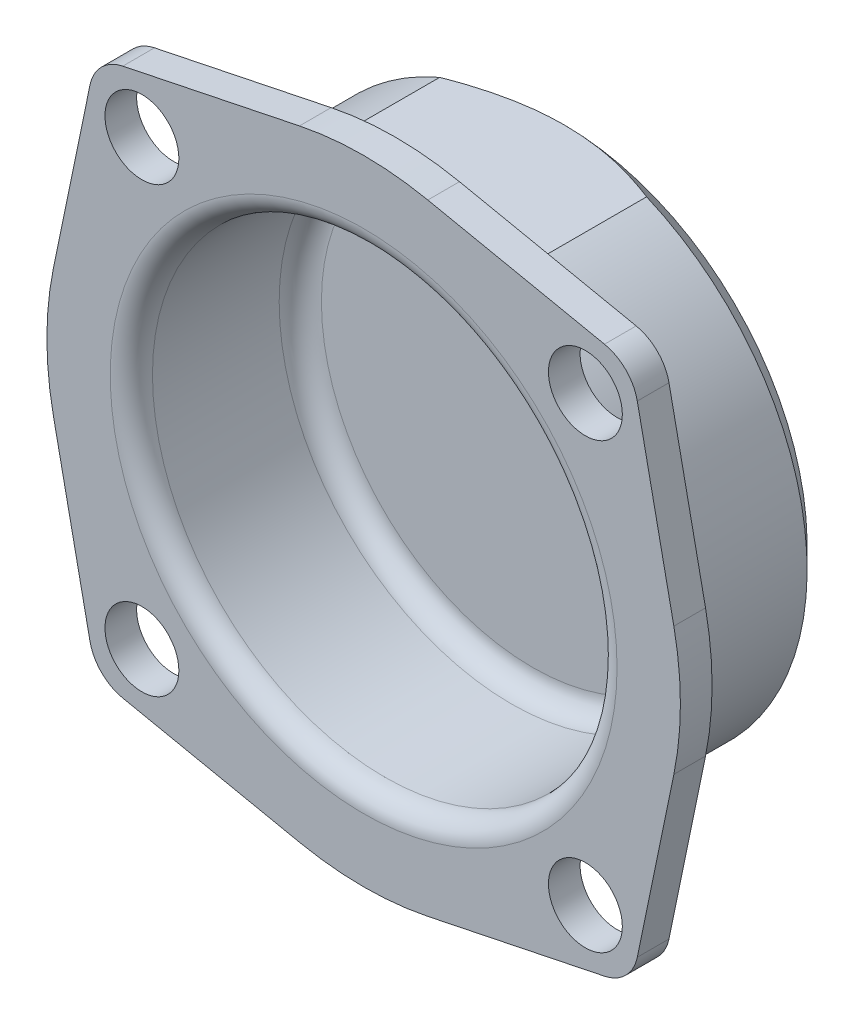
ISO-10303-21;
HEADER;
FILE_DESCRIPTION(('STEP AP214'),'2;1');
FILE_NAME('part.step','',(''),(''),'','','');
FILE_SCHEMA(('AUTOMOTIVE_DESIGN { 1 0 10303 214 1 1 1 1 }'));
ENDSEC;
DATA;
#1=APPLICATION_CONTEXT('core data for automotive mechanical design processes');
#2=APPLICATION_PROTOCOL_DEFINITION('international standard','automotive_design',2000,#1);
#3=PRODUCT_CONTEXT('',#1,'mechanical');
#4=PRODUCT('Part','Part','',(#3));
#5=PRODUCT_RELATED_PRODUCT_CATEGORY('part','',(#4));
#6=PRODUCT_DEFINITION_FORMATION('','',#4);
#7=PRODUCT_DEFINITION_CONTEXT('part definition',#1,'design');
#8=PRODUCT_DEFINITION('design','',#6,#7);
#9=PRODUCT_DEFINITION_SHAPE('','',#8);
#10=(LENGTH_UNIT() NAMED_UNIT(*) SI_UNIT(.MILLI.,.METRE.));
#11=(NAMED_UNIT(*) PLANE_ANGLE_UNIT() SI_UNIT($,.RADIAN.));
#12=(NAMED_UNIT(*) SI_UNIT($,.STERADIAN.) SOLID_ANGLE_UNIT());
#13=UNCERTAINTY_MEASURE_WITH_UNIT(LENGTH_MEASURE(1.E-05),#10,'distance_accuracy_value','');
#14=(GEOMETRIC_REPRESENTATION_CONTEXT(3) GLOBAL_UNCERTAINTY_ASSIGNED_CONTEXT((#13)) GLOBAL_UNIT_ASSIGNED_CONTEXT((#10,
#11,#12)) REPRESENTATION_CONTEXT('',''));
#15=CARTESIAN_POINT('',(0.,0.,0.));
#16=DIRECTION('',(0.,0.,1.));
#17=DIRECTION('',(1.,0.,0.));
#18=AXIS2_PLACEMENT_3D('',#15,#16,#17);
#19=CARTESIAN_POINT('',(0.,0.,-8.));
#20=DIRECTION('',(0.,0.,1.));
#21=DIRECTION('',(1.,0.,0.));
#22=AXIS2_PLACEMENT_3D('',#19,#20,#21);
#23=CYLINDRICAL_SURFACE('',#22,12.5);
#24=DIRECTION('',(0.,0.,1.));
#25=VECTOR('',#24,1.);
#26=CARTESIAN_POINT('',(-4.89897948556636,11.5,-8.));
#27=LINE('',#26,#25);
#28=CARTESIAN_POINT('',(-4.89897948556637,11.5,-7.));
#29=VERTEX_POINT('',#28);
#30=CARTESIAN_POINT('',(-4.89897948556636,11.5,0.));
#31=VERTEX_POINT('',#30);
#32=EDGE_CURVE('E462',#29,#31,#27,.T.);
#33=ORIENTED_EDGE('',*,*,#32,.F.);
#34=CARTESIAN_POINT('',(0.,0.,-7.));
#35=DIRECTION('',(0.,0.,-1.));
#36=DIRECTION('',(-1.,0.,0.));
#37=AXIS2_PLACEMENT_3D('',#34,#35,#36);
#38=CIRCLE('',#37,12.5);
#39=CARTESIAN_POINT('',(4.89897948556636,11.5,-7.));
#40=VERTEX_POINT('',#39);
#41=EDGE_CURVE('E175',#29,#40,#38,.F.);
#42=ORIENTED_EDGE('',*,*,#41,.T.);
#43=DIRECTION('',(0.,0.,1.));
#44=VECTOR('',#43,1.);
#45=CARTESIAN_POINT('',(4.89897948556636,11.5,-8.));
#46=LINE('',#45,#44);
#47=CARTESIAN_POINT('',(4.89897948556636,11.5,0.));
#48=VERTEX_POINT('',#47);
#49=EDGE_CURVE('E54',#48,#40,#46,.F.);
#50=ORIENTED_EDGE('',*,*,#49,.F.);
#51=CARTESIAN_POINT('',(0.,0.,0.));
#52=DIRECTION('',(0.,0.,1.));
#53=DIRECTION('',(1.,0.,0.));
#54=AXIS2_PLACEMENT_3D('',#51,#52,#53);
#55=CIRCLE('',#54,12.5);
#56=EDGE_CURVE('E178',#48,#31,#55,.F.);
#57=ORIENTED_EDGE('',*,*,#56,.T.);
#58=EDGE_LOOP('',(#33,#42,#50,#57));
#59=FACE_BOUND('',#58,.T.);
#60=ADVANCED_FACE('F34',(#59),#23,.T.);
#61=CARTESIAN_POINT('',(0.,0.,-8.));
#62=DIRECTION('',(0.,0.,1.));
#63=DIRECTION('',(1.,0.,0.));
#64=AXIS2_PLACEMENT_3D('',#61,#62,#63);
#65=CONICAL_SURFACE('',#64,11.5,0.785398163397447);
#66=ORIENTED_EDGE('',*,*,#41,.F.);
#67=CARTESIAN_POINT('',(-16.7893806539627,11.5,0.850265421946186));
#68=CARTESIAN_POINT('',(-16.5781152123925,11.5,0.675970375607753));
#69=CARTESIAN_POINT('',(-16.3663375360615,11.5,0.502296373561241));
#70=CARTESIAN_POINT('',(-15.941654846608,11.5,0.156326545011898));
#71=CARTESIAN_POINT('',(-15.7287498180874,11.5,-0.0159692625855204));
#72=CARTESIAN_POINT('',(-15.0880959462895,11.5,-0.530660186421689));
#73=CARTESIAN_POINT('',(-14.6585092962424,11.5,-0.870775283439131));
#74=CARTESIAN_POINT('',(-13.7887008329747,11.5,-1.54721063856355));
#75=CARTESIAN_POINT('',(-13.3484139572344,11.5,-1.88344745885357));
#76=CARTESIAN_POINT('',(-12.4606521653116,11.5,-2.54621997002668));
#77=CARTESIAN_POINT('',(-12.0131779611118,11.5,-2.8727566127966));
#78=CARTESIAN_POINT('',(-11.0655960044422,11.5,-3.54459786241297));
#79=CARTESIAN_POINT('',(-10.5645928452057,11.5,-3.88865088814603));
#80=CARTESIAN_POINT('',(-9.80316699203502,11.5,-4.38987855089019));
#81=CARTESIAN_POINT('',(-9.54764936532944,11.5,-4.55451261414054));
#82=CARTESIAN_POINT('',(-9.03295907910541,11.5,-4.87795434418192));
#83=CARTESIAN_POINT('',(-8.77378660212332,11.5,-5.03676230053297));
#84=CARTESIAN_POINT('',(-8.2525927972949,11.5,-5.34685088337027));
#85=CARTESIAN_POINT('',(-7.99059025353737,11.5,-5.49816300093233));
#86=CARTESIAN_POINT('',(-7.46213638530956,11.5,-5.79287165256753));
#87=CARTESIAN_POINT('',(-7.19568482449373,11.5,-5.93626776436429));
#88=CARTESIAN_POINT('',(-6.65814470815917,11.5,-6.21361877800879));
#89=CARTESIAN_POINT('',(-6.3870597373284,11.5,-6.34758060140613));
#90=CARTESIAN_POINT('',(-5.8397462138639,11.5,-6.60448697073004));
#91=CARTESIAN_POINT('',(-5.56351861036631,11.5,-6.7274335257846));
#92=CARTESIAN_POINT('',(-5.08838294776905,11.5,-6.92582450474964));
#93=CARTESIAN_POINT('',(-4.89084353245352,11.5,-7.00454183515921));
#94=CARTESIAN_POINT('',(-4.49307368490328,11.5,-7.15480796518391));
#95=CARTESIAN_POINT('',(-4.29284326969638,11.5,-7.22635681013479));
#96=CARTESIAN_POINT('',(-3.68799462005856,11.5,-7.42907712272961));
#97=CARTESIAN_POINT('',(-3.27920983645376,11.5,-7.54832626155526));
#98=CARTESIAN_POINT('',(-2.66380646654365,11.5,-7.6971464780819));
#99=CARTESIAN_POINT('',(-2.46065900763788,11.5,-7.74139924904552));
#100=CARTESIAN_POINT('',(-2.05246632515672,11.5,-7.81999370495297));
#101=CARTESIAN_POINT('',(-1.84742143183298,11.5,-7.85433708236045));
#102=CARTESIAN_POINT('',(-1.43586143588119,11.5,-7.91249812274399));
#103=CARTESIAN_POINT('',(-1.22934648189982,11.5,-7.93631683499167));
#104=CARTESIAN_POINT('',(-0.815340554579247,11.5,-7.972976266415));
#105=CARTESIAN_POINT('',(-0.60784959986402,11.5,-7.98581719422021));
#106=CARTESIAN_POINT('',(-0.203862685658172,11.5,-7.9998666522852));
#107=CARTESIAN_POINT('',(-0.00738741914860604,11.5,-8.00167417627281));
#108=CARTESIAN_POINT('',(0.385419506898061,11.5,-7.99521933224475));
#109=CARTESIAN_POINT('',(0.581751147457329,11.5,-7.98695581339273));
#110=CARTESIAN_POINT('',(0.973727497499538,11.5,-7.96050606581626));
#111=CARTESIAN_POINT('',(1.1693722645929,11.5,-7.94232069029956));
#112=CARTESIAN_POINT('',(1.55954085045931,11.5,-7.89635450354384));
#113=CARTESIAN_POINT('',(1.75406450676635,11.5,-7.86857233544811));
#114=CARTESIAN_POINT('',(2.34278481038758,11.5,-7.7702396159328));
#115=CARTESIAN_POINT('',(2.73463308785112,11.5,-7.68523071640806));
#116=CARTESIAN_POINT('',(3.50946382045011,11.5,-7.48225481038822));
#117=CARTESIAN_POINT('',(3.8924463631884,11.5,-7.36428812970148));
#118=CARTESIAN_POINT('',(4.65553265872848,11.5,-7.09863984114778));
#119=CARTESIAN_POINT('',(5.03546293520018,11.5,-6.95046531148941));
#120=CARTESIAN_POINT('',(5.78561365161127,11.5,-6.63112210212623));
#121=CARTESIAN_POINT('',(6.1558297747009,11.5,-6.45994339977846));
#122=CARTESIAN_POINT('',(6.88825377985408,11.5,-6.09864750750538));
#123=CARTESIAN_POINT('',(7.25043331947737,11.5,-5.90847332424411));
#124=CARTESIAN_POINT('',(7.96651940017898,11.5,-5.51335323980783));
#125=CARTESIAN_POINT('',(8.32042716545895,11.5,-5.30840954305199));
#126=CARTESIAN_POINT('',(9.00371944014477,11.5,-4.89704477088385));
#127=CARTESIAN_POINT('',(9.33345132945047,11.5,-4.69119765945711));
#128=CARTESIAN_POINT('',(9.98724918210649,11.5,-4.27066877256768));
#129=CARTESIAN_POINT('',(10.3113147240286,11.5,-4.05598634393704));
#130=CARTESIAN_POINT('',(10.9519411526873,11.5,-3.6210819828637));
#131=CARTESIAN_POINT('',(11.2685411759533,11.5,-3.4009174919943));
#132=CARTESIAN_POINT('',(11.8973875507789,11.5,-2.9546304003391));
#133=CARTESIAN_POINT('',(12.2096350775222,11.5,-2.72850945739908));
#134=CARTESIAN_POINT('',(12.5200543334183,11.5,-2.49994822032164));
#135=B_SPLINE_CURVE_WITH_KNOTS('',3,(#67,#68,#69,#70,#71,#72,#73,#74,#75,#76,#77,#78,#79,#80,
#81,#82,#83,#84,#85,#86,#87,#88,#89,#90,#91,#92,#93,#94,#95,#96,#97,#98,#99,#100,#101,#102,#103,
#104,#105,#106,#107,#108,#109,#110,#111,#112,#113,#114,#115,#116,#117,#118,#119,#120,#121,#122,
#123,#124,#125,#126,#127,#128,#129,#130,#131,#132,#133,#134),.UNSPECIFIED.,.F.,.F.,(4,2,2,2,2,2,
2,2,2,2,2,2,2,2,2,2,2,2,2,2,2,2,2,2,2,2,2,2,2,2,2,2,2,4),(0.,0.821646739742719,1.64330473118004,
3.28701381270533,4.94888238357663,6.61058733148289,8.43346611694427,9.34529408146708,
10.2570766661826,11.1646310892773,12.0722338788335,12.9791637070034,13.8859277776618,
14.5237304591109,15.1615291066404,16.4370966523403,17.0606376750111,17.6840721375749,
18.3074444319117,18.9308048789779,19.5199990671665,20.1092605899582,20.6984714485147,
21.2877656476402,22.4888066466736,23.6898357730833,24.9123078459458,26.1353142725621,
27.3621071656067,28.5887173317757,29.7546852611505,30.9207395423446,32.0775453151114,
33.2340324495483),.UNSPECIFIED.);
#136=CARTESIAN_POINT('',(0.,11.5,-8.));
#137=VERTEX_POINT('',#136);
#138=EDGE_CURVE('E11',#29,#137,#135,.T.);
#139=ORIENTED_EDGE('',*,*,#138,.T.);
#140=CARTESIAN_POINT('',(0.,0.,-8.));
#141=DIRECTION('',(0.,0.,-1.));
#142=DIRECTION('',(-1.,0.,0.));
#143=AXIS2_PLACEMENT_3D('',#140,#141,#142);
#144=CIRCLE('',#143,11.5);
#145=EDGE_CURVE('E174',#137,#137,#144,.T.);
#146=ORIENTED_EDGE('',*,*,#145,.F.);
#147=EDGE_CURVE('E38',#137,#40,#135,.T.);
#148=ORIENTED_EDGE('',*,*,#147,.T.);
#149=EDGE_LOOP('',(#66,#139,#146,#148));
#150=FACE_BOUND('',#149,.T.);
#151=ADVANCED_FACE('F173',(#150),#65,.T.);
#152=CARTESIAN_POINT('',(11.,11.,0.));
#153=DIRECTION('',(0.,0.,1.));
#154=DIRECTION('',(1.,0.,0.));
#155=AXIS2_PLACEMENT_3D('',#152,#153,#154);
#156=PLANE('',#155);
#157=ORIENTED_EDGE('',*,*,#56,.F.);
#158=DIRECTION('',(-1.,0.,0.));
#159=VECTOR('',#158,1.);
#160=CARTESIAN_POINT('',(7.6799024524554,11.5,0.));
#161=LINE('',#160,#159);
#162=EDGE_CURVE('E465',#48,#31,#161,.T.);
#163=ORIENTED_EDGE('',*,*,#162,.T.);
#164=EDGE_LOOP('',(#157,#163));
#165=FACE_BOUND('',#164,.T.);
#166=CARTESIAN_POINT('',(0.,0.,0.));
#167=DIRECTION('',(0.,0.,1.));
#168=DIRECTION('',(1.,0.,0.));
#169=AXIS2_PLACEMENT_3D('',#166,#167,#168);
#170=CIRCLE('',#169,15.);
#171=CARTESIAN_POINT('',(3.03817926455623,14.6890934627165,0.));
#172=VERTEX_POINT('',#171);
#173=CARTESIAN_POINT('',(-3.03817926455623,14.6890934627165,0.));
#174=VERTEX_POINT('',#173);
#175=EDGE_CURVE('E321',#172,#174,#170,.T.);
#176=ORIENTED_EDGE('',*,*,#175,.F.);
#177=DIRECTION('',(-0.979272897514433,0.202545284303748,0.));
#178=VECTOR('',#177,1.);
#179=CARTESIAN_POINT('',(11.4050905686075,12.9585457950289,0.));
#180=LINE('',#179,#178);
#181=CARTESIAN_POINT('',(11.4050905686075,12.9585457950289,0.));
#182=VERTEX_POINT('',#181);
#183=EDGE_CURVE('E312',#182,#172,#180,.T.);
#184=ORIENTED_EDGE('',*,*,#183,.F.);
#185=CARTESIAN_POINT('',(11.,11.,0.));
#186=DIRECTION('',(0.,0.,1.));
#187=DIRECTION('',(1.,0.,0.));
#188=AXIS2_PLACEMENT_3D('',#185,#186,#187);
#189=CIRCLE('',#188,2.00000000000001);
#190=CARTESIAN_POINT('',(12.9585457950289,11.4050905686075,0.));
#191=VERTEX_POINT('',#190);
#192=EDGE_CURVE('E322',#191,#182,#189,.T.);
#193=ORIENTED_EDGE('',*,*,#192,.F.);
#194=DIRECTION('',(-0.202545284303748,0.979272897514433,0.));
#195=VECTOR('',#194,1.);
#196=CARTESIAN_POINT('',(14.6890934627165,3.03817926455623,0.));
#197=LINE('',#196,#195);
#198=CARTESIAN_POINT('',(14.6890934627165,3.03817926455623,0.));
#199=VERTEX_POINT('',#198);
#200=EDGE_CURVE('E359',#199,#191,#197,.T.);
#201=ORIENTED_EDGE('',*,*,#200,.F.);
#202=CARTESIAN_POINT('',(0.,0.,0.));
#203=DIRECTION('',(0.,0.,1.));
#204=DIRECTION('',(1.,0.,0.));
#205=AXIS2_PLACEMENT_3D('',#202,#203,#204);
#206=CIRCLE('',#205,15.);
#207=CARTESIAN_POINT('',(14.6890934627165,-3.03817926455622,0.));
#208=VERTEX_POINT('',#207);
#209=EDGE_CURVE('E357',#208,#199,#206,.T.);
#210=ORIENTED_EDGE('',*,*,#209,.F.);
#211=DIRECTION('',(0.202545284303748,0.979272897514433,0.));
#212=VECTOR('',#211,1.);
#213=CARTESIAN_POINT('',(12.9585457950289,-11.4050905686075,0.));
#214=LINE('',#213,#212);
#215=CARTESIAN_POINT('',(12.9585457950289,-11.4050905686075,0.));
#216=VERTEX_POINT('',#215);
#217=EDGE_CURVE('E355',#216,#208,#214,.T.);
#218=ORIENTED_EDGE('',*,*,#217,.F.);
#219=CARTESIAN_POINT('',(11.,-11.,0.));
#220=DIRECTION('',(0.,0.,1.));
#221=DIRECTION('',(1.,0.,0.));
#222=AXIS2_PLACEMENT_3D('',#219,#220,#221);
#223=CIRCLE('',#222,2.);
#224=CARTESIAN_POINT('',(11.4050905686075,-12.9585457950289,0.));
#225=VERTEX_POINT('',#224);
#226=EDGE_CURVE('E353',#225,#216,#223,.T.);
#227=ORIENTED_EDGE('',*,*,#226,.F.);
#228=DIRECTION('',(0.979272897514433,0.202545284303749,0.));
#229=VECTOR('',#228,1.);
#230=CARTESIAN_POINT('',(3.03817926455623,-14.6890934627165,0.));
#231=LINE('',#230,#229);
#232=CARTESIAN_POINT('',(3.03817926455623,-14.6890934627165,0.));
#233=VERTEX_POINT('',#232);
#234=EDGE_CURVE('E351',#233,#225,#231,.T.);
#235=ORIENTED_EDGE('',*,*,#234,.F.);
#236=CARTESIAN_POINT('',(0.,0.,0.));
#237=DIRECTION('',(0.,0.,1.));
#238=DIRECTION('',(1.,0.,0.));
#239=AXIS2_PLACEMENT_3D('',#236,#237,#238);
#240=CIRCLE('',#239,15.);
#241=CARTESIAN_POINT('',(-3.03817926455624,-14.6890934627165,0.));
#242=VERTEX_POINT('',#241);
#243=EDGE_CURVE('E349',#242,#233,#240,.T.);
#244=ORIENTED_EDGE('',*,*,#243,.F.);
#245=DIRECTION('',(0.979272897514433,-0.20254528430375,0.));
#246=VECTOR('',#245,1.);
#247=CARTESIAN_POINT('',(-11.4050905686075,-12.9585457950289,0.));
#248=LINE('',#247,#246);
#249=CARTESIAN_POINT('',(-11.4050905686075,-12.9585457950289,0.));
#250=VERTEX_POINT('',#249);
#251=EDGE_CURVE('E347',#250,#242,#248,.T.);
#252=ORIENTED_EDGE('',*,*,#251,.F.);
#253=CARTESIAN_POINT('',(-11.,-11.,0.));
#254=DIRECTION('',(0.,0.,1.));
#255=DIRECTION('',(1.,0.,0.));
#256=AXIS2_PLACEMENT_3D('',#253,#254,#255);
#257=CIRCLE('',#256,2.);
#258=CARTESIAN_POINT('',(-12.9585457950289,-11.4050905686075,0.));
#259=VERTEX_POINT('',#258);
#260=EDGE_CURVE('E345',#259,#250,#257,.T.);
#261=ORIENTED_EDGE('',*,*,#260,.F.);
#262=DIRECTION('',(0.202545284303749,-0.979272897514433,0.));
#263=VECTOR('',#262,1.);
#264=CARTESIAN_POINT('',(-14.6890934627165,-3.03817926455623,0.));
#265=LINE('',#264,#263);
#266=CARTESIAN_POINT('',(-14.6890934627165,-3.03817926455623,0.));
#267=VERTEX_POINT('',#266);
#268=EDGE_CURVE('E343',#267,#259,#265,.T.);
#269=ORIENTED_EDGE('',*,*,#268,.F.);
#270=CARTESIAN_POINT('',(0.,0.,0.));
#271=DIRECTION('',(0.,0.,1.));
#272=DIRECTION('',(1.,0.,0.));
#273=AXIS2_PLACEMENT_3D('',#270,#271,#272);
#274=CIRCLE('',#273,15.);
#275=CARTESIAN_POINT('',(-14.6890934627165,3.03817926455624,0.));
#276=VERTEX_POINT('',#275);
#277=EDGE_CURVE('E341',#276,#267,#274,.T.);
#278=ORIENTED_EDGE('',*,*,#277,.F.);
#279=DIRECTION('',(-0.202545284303749,-0.979272897514433,0.));
#280=VECTOR('',#279,1.);
#281=CARTESIAN_POINT('',(-12.9585457950289,11.4050905686075,0.));
#282=LINE('',#281,#280);
#283=CARTESIAN_POINT('',(-12.9585457950289,11.4050905686075,0.));
#284=VERTEX_POINT('',#283);
#285=EDGE_CURVE('E339',#284,#276,#282,.T.);
#286=ORIENTED_EDGE('',*,*,#285,.F.);
#287=CARTESIAN_POINT('',(-11.,11.,0.));
#288=DIRECTION('',(0.,0.,1.));
#289=DIRECTION('',(1.,0.,0.));
#290=AXIS2_PLACEMENT_3D('',#287,#288,#289);
#291=CIRCLE('',#290,2.);
#292=CARTESIAN_POINT('',(-11.4050905686075,12.9585457950289,0.));
#293=VERTEX_POINT('',#292);
#294=EDGE_CURVE('E334',#293,#284,#291,.T.);
#295=ORIENTED_EDGE('',*,*,#294,.F.);
#296=DIRECTION('',(-0.979272897514433,-0.202545284303749,0.));
#297=VECTOR('',#296,1.);
#298=CARTESIAN_POINT('',(-11.4050905686075,12.9585457950289,0.));
#299=LINE('',#298,#297);
#300=EDGE_CURVE('E332',#174,#293,#299,.T.);
#301=ORIENTED_EDGE('',*,*,#300,.F.);
#302=EDGE_LOOP('',(#176,#184,#193,#201,#210,#218,#227,#235,#244,#252,#261,#269,#278,#286,#295,#301));
#303=FACE_BOUND('',#302,.T.);
#304=CARTESIAN_POINT('',(-10.4999999999998,-10.5,0.));
#305=DIRECTION('',(0.,0.,1.));
#306=DIRECTION('',(1.,0.,0.));
#307=AXIS2_PLACEMENT_3D('',#304,#305,#306);
#308=CIRCLE('',#307,1.75);
#309=CARTESIAN_POINT('',(-8.74999999999978,-10.5,0.));
#310=VERTEX_POINT('',#309);
#311=EDGE_CURVE('E453',#310,#310,#308,.T.);
#312=ORIENTED_EDGE('',*,*,#311,.T.);
#313=EDGE_LOOP('',(#312));
#314=FACE_BOUND('',#313,.T.);
#315=CARTESIAN_POINT('',(-10.5,10.5,0.));
#316=DIRECTION('',(0.,0.,1.));
#317=DIRECTION('',(1.,0.,0.));
#318=AXIS2_PLACEMENT_3D('',#315,#316,#317);
#319=CIRCLE('',#318,1.75);
#320=CARTESIAN_POINT('',(-8.75,10.5,0.));
#321=VERTEX_POINT('',#320);
#322=EDGE_CURVE('E439',#321,#321,#319,.T.);
#323=ORIENTED_EDGE('',*,*,#322,.T.);
#324=EDGE_LOOP('',(#323));
#325=FACE_BOUND('',#324,.T.);
#326=CARTESIAN_POINT('',(10.5,10.5000000000003,0.));
#327=DIRECTION('',(0.,0.,1.));
#328=DIRECTION('',(1.,0.,0.));
#329=AXIS2_PLACEMENT_3D('',#326,#327,#328);
#330=CIRCLE('',#329,1.75);
#331=CARTESIAN_POINT('',(12.25,10.5000000000003,0.));
#332=VERTEX_POINT('',#331);
#333=EDGE_CURVE('E447',#332,#332,#330,.T.);
#334=ORIENTED_EDGE('',*,*,#333,.T.);
#335=EDGE_LOOP('',(#334));
#336=FACE_BOUND('',#335,.T.);
#337=CARTESIAN_POINT('',(10.5000000000002,-10.4999999999997,0.));
#338=DIRECTION('',(0.,0.,1.));
#339=DIRECTION('',(1.,0.,0.));
#340=AXIS2_PLACEMENT_3D('',#337,#338,#339);
#341=CIRCLE('',#340,1.75);
#342=CARTESIAN_POINT('',(12.2500000000002,-10.4999999999997,0.));
#343=VERTEX_POINT('',#342);
#344=EDGE_CURVE('E459',#343,#343,#341,.T.);
#345=ORIENTED_EDGE('',*,*,#344,.T.);
#346=EDGE_LOOP('',(#345));
#347=FACE_BOUND('',#346,.T.);
#348=ADVANCED_FACE('F226',(#165,#303,#314,#325,#336,#347),#156,.F.);
#349=CARTESIAN_POINT('',(11.,11.,1.5));
#350=DIRECTION('',(0.,0.,1.));
#351=DIRECTION('',(1.,0.,0.));
#352=AXIS2_PLACEMENT_3D('',#349,#350,#351);
#353=PLANE('',#352);
#354=CARTESIAN_POINT('',(0.,0.,1.5));
#355=DIRECTION('',(0.,0.,1.));
#356=DIRECTION('',(1.,0.,0.));
#357=AXIS2_PLACEMENT_3D('',#354,#355,#356);
#358=CIRCLE('',#357,12.);
#359=CARTESIAN_POINT('',(12.,0.,1.5));
#360=VERTEX_POINT('',#359);
#361=EDGE_CURVE('E171',#360,#360,#358,.F.);
#362=ORIENTED_EDGE('',*,*,#361,.T.);
#363=EDGE_LOOP('',(#362));
#364=FACE_BOUND('',#363,.T.);
#365=CARTESIAN_POINT('',(-10.4999999999998,-10.5,1.5));
#366=DIRECTION('',(0.,0.,1.));
#367=DIRECTION('',(1.,0.,0.));
#368=AXIS2_PLACEMENT_3D('',#365,#366,#367);
#369=CIRCLE('',#368,1.75);
#370=CARTESIAN_POINT('',(-8.74999999999978,-10.5,1.5));
#371=VERTEX_POINT('',#370);
#372=EDGE_CURVE('E450',#371,#371,#369,.T.);
#373=ORIENTED_EDGE('',*,*,#372,.F.);
#374=EDGE_LOOP('',(#373));
#375=FACE_BOUND('',#374,.T.);
#376=CARTESIAN_POINT('',(-10.5,10.5,1.5));
#377=DIRECTION('',(0.,0.,1.));
#378=DIRECTION('',(1.,0.,0.));
#379=AXIS2_PLACEMENT_3D('',#376,#377,#378);
#380=CIRCLE('',#379,1.75);
#381=CARTESIAN_POINT('',(-8.75,10.5,1.5));
#382=VERTEX_POINT('',#381);
#383=EDGE_CURVE('E437',#382,#382,#380,.T.);
#384=ORIENTED_EDGE('',*,*,#383,.F.);
#385=EDGE_LOOP('',(#384));
#386=FACE_BOUND('',#385,.T.);
#387=CARTESIAN_POINT('',(11.,11.,1.5));
#388=DIRECTION('',(0.,0.,1.));
#389=DIRECTION('',(1.,0.,0.));
#390=AXIS2_PLACEMENT_3D('',#387,#388,#389);
#391=CIRCLE('',#390,2.00000000000001);
#392=CARTESIAN_POINT('',(12.9585457950289,11.4050905686075,1.5));
#393=VERTEX_POINT('',#392);
#394=CARTESIAN_POINT('',(11.4050905686075,12.9585457950289,1.5));
#395=VERTEX_POINT('',#394);
#396=EDGE_CURVE('E361',#393,#395,#391,.T.);
#397=ORIENTED_EDGE('',*,*,#396,.T.);
#398=DIRECTION('',(-0.979272897514433,0.202545284303748,0.));
#399=VECTOR('',#398,1.);
#400=CARTESIAN_POINT('',(11.4050905686075,12.9585457950289,1.5));
#401=LINE('',#400,#399);
#402=CARTESIAN_POINT('',(3.03817926455623,14.6890934627165,1.5));
#403=VERTEX_POINT('',#402);
#404=EDGE_CURVE('E363',#395,#403,#401,.T.);
#405=ORIENTED_EDGE('',*,*,#404,.T.);
#406=CARTESIAN_POINT('',(0.,0.,1.5));
#407=DIRECTION('',(0.,0.,1.));
#408=DIRECTION('',(1.,0.,0.));
#409=AXIS2_PLACEMENT_3D('',#406,#407,#408);
#410=CIRCLE('',#409,15.);
#411=CARTESIAN_POINT('',(-3.03817926455623,14.6890934627165,1.5));
#412=VERTEX_POINT('',#411);
#413=EDGE_CURVE('E326',#403,#412,#410,.T.);
#414=ORIENTED_EDGE('',*,*,#413,.T.);
#415=DIRECTION('',(-0.979272897514433,-0.202545284303749,0.));
#416=VECTOR('',#415,1.);
#417=CARTESIAN_POINT('',(-11.4050905686075,12.9585457950289,1.5));
#418=LINE('',#417,#416);
#419=CARTESIAN_POINT('',(-11.4050905686075,12.9585457950289,1.5));
#420=VERTEX_POINT('',#419);
#421=EDGE_CURVE('E366',#412,#420,#418,.T.);
#422=ORIENTED_EDGE('',*,*,#421,.T.);
#423=CARTESIAN_POINT('',(-11.,11.,1.5));
#424=DIRECTION('',(0.,0.,1.));
#425=DIRECTION('',(1.,0.,0.));
#426=AXIS2_PLACEMENT_3D('',#423,#424,#425);
#427=CIRCLE('',#426,2.);
#428=CARTESIAN_POINT('',(-12.9585457950289,11.4050905686075,1.5));
#429=VERTEX_POINT('',#428);
#430=EDGE_CURVE('E368',#420,#429,#427,.T.);
#431=ORIENTED_EDGE('',*,*,#430,.T.);
#432=DIRECTION('',(-0.202545284303749,-0.979272897514433,0.));
#433=VECTOR('',#432,1.);
#434=CARTESIAN_POINT('',(-12.9585457950289,11.4050905686075,1.5));
#435=LINE('',#434,#433);
#436=CARTESIAN_POINT('',(-14.6890934627165,3.03817926455624,1.5));
#437=VERTEX_POINT('',#436);
#438=EDGE_CURVE('E370',#429,#437,#435,.T.);
#439=ORIENTED_EDGE('',*,*,#438,.T.);
#440=CARTESIAN_POINT('',(0.,0.,1.5));
#441=DIRECTION('',(0.,0.,1.));
#442=DIRECTION('',(1.,0.,0.));
#443=AXIS2_PLACEMENT_3D('',#440,#441,#442);
#444=CIRCLE('',#443,15.);
#445=CARTESIAN_POINT('',(-14.6890934627165,-3.03817926455623,1.5));
#446=VERTEX_POINT('',#445);
#447=EDGE_CURVE('E372',#437,#446,#444,.T.);
#448=ORIENTED_EDGE('',*,*,#447,.T.);
#449=DIRECTION('',(0.202545284303749,-0.979272897514433,0.));
#450=VECTOR('',#449,1.);
#451=CARTESIAN_POINT('',(-14.6890934627165,-3.03817926455623,1.5));
#452=LINE('',#451,#450);
#453=CARTESIAN_POINT('',(-12.9585457950289,-11.4050905686075,1.5));
#454=VERTEX_POINT('',#453);
#455=EDGE_CURVE('E374',#446,#454,#452,.T.);
#456=ORIENTED_EDGE('',*,*,#455,.T.);
#457=CARTESIAN_POINT('',(-11.,-11.,1.5));
#458=DIRECTION('',(0.,0.,1.));
#459=DIRECTION('',(1.,0.,0.));
#460=AXIS2_PLACEMENT_3D('',#457,#458,#459);
#461=CIRCLE('',#460,2.);
#462=CARTESIAN_POINT('',(-11.4050905686075,-12.9585457950289,1.5));
#463=VERTEX_POINT('',#462);
#464=EDGE_CURVE('E376',#454,#463,#461,.T.);
#465=ORIENTED_EDGE('',*,*,#464,.T.);
#466=DIRECTION('',(0.979272897514433,-0.20254528430375,0.));
#467=VECTOR('',#466,1.);
#468=CARTESIAN_POINT('',(-11.4050905686075,-12.9585457950289,1.5));
#469=LINE('',#468,#467);
#470=CARTESIAN_POINT('',(-3.03817926455624,-14.6890934627165,1.5));
#471=VERTEX_POINT('',#470);
#472=EDGE_CURVE('E378',#463,#471,#469,.T.);
#473=ORIENTED_EDGE('',*,*,#472,.T.);
#474=CARTESIAN_POINT('',(0.,0.,1.5));
#475=DIRECTION('',(0.,0.,1.));
#476=DIRECTION('',(1.,0.,0.));
#477=AXIS2_PLACEMENT_3D('',#474,#475,#476);
#478=CIRCLE('',#477,15.);
#479=CARTESIAN_POINT('',(3.03817926455623,-14.6890934627165,1.5));
#480=VERTEX_POINT('',#479);
#481=EDGE_CURVE('E380',#471,#480,#478,.T.);
#482=ORIENTED_EDGE('',*,*,#481,.T.);
#483=DIRECTION('',(0.979272897514433,0.202545284303749,0.));
#484=VECTOR('',#483,1.);
#485=CARTESIAN_POINT('',(3.03817926455623,-14.6890934627165,1.5));
#486=LINE('',#485,#484);
#487=CARTESIAN_POINT('',(11.4050905686075,-12.9585457950289,1.5));
#488=VERTEX_POINT('',#487);
#489=EDGE_CURVE('E382',#480,#488,#486,.T.);
#490=ORIENTED_EDGE('',*,*,#489,.T.);
#491=CARTESIAN_POINT('',(11.,-11.,1.5));
#492=DIRECTION('',(0.,0.,1.));
#493=DIRECTION('',(1.,0.,0.));
#494=AXIS2_PLACEMENT_3D('',#491,#492,#493);
#495=CIRCLE('',#494,2.);
#496=CARTESIAN_POINT('',(12.9585457950289,-11.4050905686075,1.5));
#497=VERTEX_POINT('',#496);
#498=EDGE_CURVE('E384',#488,#497,#495,.T.);
#499=ORIENTED_EDGE('',*,*,#498,.T.);
#500=DIRECTION('',(0.202545284303748,0.979272897514433,0.));
#501=VECTOR('',#500,1.);
#502=CARTESIAN_POINT('',(12.9585457950289,-11.4050905686075,1.5));
#503=LINE('',#502,#501);
#504=CARTESIAN_POINT('',(14.6890934627165,-3.03817926455622,1.5));
#505=VERTEX_POINT('',#504);
#506=EDGE_CURVE('E386',#497,#505,#503,.T.);
#507=ORIENTED_EDGE('',*,*,#506,.T.);
#508=CARTESIAN_POINT('',(0.,0.,1.5));
#509=DIRECTION('',(0.,0.,1.));
#510=DIRECTION('',(1.,0.,0.));
#511=AXIS2_PLACEMENT_3D('',#508,#509,#510);
#512=CIRCLE('',#511,15.);
#513=CARTESIAN_POINT('',(14.6890934627165,3.03817926455623,1.5));
#514=VERTEX_POINT('',#513);
#515=EDGE_CURVE('E388',#505,#514,#512,.T.);
#516=ORIENTED_EDGE('',*,*,#515,.T.);
#517=DIRECTION('',(-0.202545284303748,0.979272897514433,0.));
#518=VECTOR('',#517,1.);
#519=CARTESIAN_POINT('',(14.6890934627165,3.03817926455623,1.5));
#520=LINE('',#519,#518);
#521=EDGE_CURVE('E62',#514,#393,#520,.T.);
#522=ORIENTED_EDGE('',*,*,#521,.T.);
#523=EDGE_LOOP('',(#397,#405,#414,#422,#431,#439,#448,#456,#465,#473,#482,#490,#499,#507,#516,#522));
#524=FACE_BOUND('',#523,.T.);
#525=CARTESIAN_POINT('',(10.5,10.5000000000003,1.5));
#526=DIRECTION('',(0.,0.,1.));
#527=DIRECTION('',(1.,0.,0.));
#528=AXIS2_PLACEMENT_3D('',#525,#526,#527);
#529=CIRCLE('',#528,1.75);
#530=CARTESIAN_POINT('',(12.25,10.5000000000003,1.5));
#531=VERTEX_POINT('',#530);
#532=EDGE_CURVE('E444',#531,#531,#529,.T.);
#533=ORIENTED_EDGE('',*,*,#532,.F.);
#534=EDGE_LOOP('',(#533));
#535=FACE_BOUND('',#534,.T.);
#536=CARTESIAN_POINT('',(10.5000000000002,-10.4999999999997,1.5));
#537=DIRECTION('',(0.,0.,1.));
#538=DIRECTION('',(1.,0.,0.));
#539=AXIS2_PLACEMENT_3D('',#536,#537,#538);
#540=CIRCLE('',#539,1.75);
#541=CARTESIAN_POINT('',(12.2500000000002,-10.4999999999997,1.5));
#542=VERTEX_POINT('',#541);
#543=EDGE_CURVE('E456',#542,#542,#540,.T.);
#544=ORIENTED_EDGE('',*,*,#543,.F.);
#545=EDGE_LOOP('',(#544));
#546=FACE_BOUND('',#545,.T.);
#547=ADVANCED_FACE('F197',(#364,#375,#386,#524,#535,#546),#353,.T.);
#548=CARTESIAN_POINT('',(11.,11.,1.5));
#549=DIRECTION('',(0.,0.,-1.));
#550=DIRECTION('',(-1.,0.,0.));
#551=AXIS2_PLACEMENT_3D('',#548,#549,#550);
#552=CYLINDRICAL_SURFACE('',#551,2.00000000000001);
#553=ORIENTED_EDGE('',*,*,#192,.T.);
#554=DIRECTION('',(0.,0.,-1.));
#555=VECTOR('',#554,1.);
#556=CARTESIAN_POINT('',(11.4050905686075,12.9585457950289,1.5));
#557=LINE('',#556,#555);
#558=EDGE_CURVE('E183',#395,#182,#557,.T.);
#559=ORIENTED_EDGE('',*,*,#558,.F.);
#560=ORIENTED_EDGE('',*,*,#396,.F.);
#561=DIRECTION('',(0.,0.,-1.));
#562=VECTOR('',#561,1.);
#563=CARTESIAN_POINT('',(12.9585457950289,11.4050905686075,1.5));
#564=LINE('',#563,#562);
#565=EDGE_CURVE('E391',#393,#191,#564,.T.);
#566=ORIENTED_EDGE('',*,*,#565,.T.);
#567=EDGE_LOOP('',(#553,#559,#560,#566));
#568=FACE_BOUND('',#567,.T.);
#569=ADVANCED_FACE('F36',(#568),#552,.T.);
#570=CARTESIAN_POINT('',(11.4050905686075,12.9585457950289,1.5));
#571=DIRECTION('',(-0.202545284303748,-0.979272897514433,0.));
#572=DIRECTION('',(0.979272897514433,-0.202545284303748,0.));
#573=AXIS2_PLACEMENT_3D('',#570,#571,#572);
#574=PLANE('',#573);
#575=ORIENTED_EDGE('',*,*,#183,.T.);
#576=DIRECTION('',(0.,0.,-1.));
#577=VECTOR('',#576,1.);
#578=CARTESIAN_POINT('',(3.03817926455623,14.6890934627165,1.5));
#579=LINE('',#578,#577);
#580=EDGE_CURVE('E314',#403,#172,#579,.T.);
#581=ORIENTED_EDGE('',*,*,#580,.F.);
#582=ORIENTED_EDGE('',*,*,#404,.F.);
#583=ORIENTED_EDGE('',*,*,#558,.T.);
#584=EDGE_LOOP('',(#575,#581,#582,#583));
#585=FACE_BOUND('',#584,.T.);
#586=ADVANCED_FACE('F302',(#585),#574,.F.);
#587=CARTESIAN_POINT('',(0.,0.,1.5));
#588=DIRECTION('',(0.,0.,-1.));
#589=DIRECTION('',(-1.,0.,0.));
#590=AXIS2_PLACEMENT_3D('',#587,#588,#589);
#591=CYLINDRICAL_SURFACE('',#590,15.);
#592=ORIENTED_EDGE('',*,*,#175,.T.);
#593=DIRECTION('',(0.,0.,-1.));
#594=VECTOR('',#593,1.);
#595=CARTESIAN_POINT('',(-3.03817926455623,14.6890934627165,1.5));
#596=LINE('',#595,#594);
#597=EDGE_CURVE('E327',#412,#174,#596,.T.);
#598=ORIENTED_EDGE('',*,*,#597,.F.);
#599=ORIENTED_EDGE('',*,*,#413,.F.);
#600=ORIENTED_EDGE('',*,*,#580,.T.);
#601=EDGE_LOOP('',(#592,#598,#599,#600));
#602=FACE_BOUND('',#601,.T.);
#603=ADVANCED_FACE('F299',(#602),#591,.T.);
#604=CARTESIAN_POINT('',(-11.4050905686075,12.9585457950289,1.5));
#605=DIRECTION('',(0.202545284303749,-0.979272897514433,0.));
#606=DIRECTION('',(0.979272897514433,0.202545284303749,0.));
#607=AXIS2_PLACEMENT_3D('',#604,#605,#606);
#608=PLANE('',#607);
#609=ORIENTED_EDGE('',*,*,#300,.T.);
#610=DIRECTION('',(0.,0.,-1.));
#611=VECTOR('',#610,1.);
#612=CARTESIAN_POINT('',(-11.4050905686075,12.9585457950289,1.5));
#613=LINE('',#612,#611);
#614=EDGE_CURVE('E427',#420,#293,#613,.T.);
#615=ORIENTED_EDGE('',*,*,#614,.F.);
#616=ORIENTED_EDGE('',*,*,#421,.F.);
#617=ORIENTED_EDGE('',*,*,#597,.T.);
#618=EDGE_LOOP('',(#609,#615,#616,#617));
#619=FACE_BOUND('',#618,.T.);
#620=ADVANCED_FACE('F295',(#619),#608,.F.);
#621=CARTESIAN_POINT('',(-11.,11.,1.5));
#622=DIRECTION('',(0.,0.,-1.));
#623=DIRECTION('',(-1.,0.,0.));
#624=AXIS2_PLACEMENT_3D('',#621,#622,#623);
#625=CYLINDRICAL_SURFACE('',#624,2.);
#626=ORIENTED_EDGE('',*,*,#294,.T.);
#627=DIRECTION('',(0.,0.,-1.));
#628=VECTOR('',#627,1.);
#629=CARTESIAN_POINT('',(-12.9585457950289,11.4050905686075,1.5));
#630=LINE('',#629,#628);
#631=EDGE_CURVE('E424',#429,#284,#630,.T.);
#632=ORIENTED_EDGE('',*,*,#631,.F.);
#633=ORIENTED_EDGE('',*,*,#430,.F.);
#634=ORIENTED_EDGE('',*,*,#614,.T.);
#635=EDGE_LOOP('',(#626,#632,#633,#634));
#636=FACE_BOUND('',#635,.T.);
#637=ADVANCED_FACE('F291',(#636),#625,.T.);
#638=CARTESIAN_POINT('',(-12.9585457950289,11.4050905686075,1.5));
#639=DIRECTION('',(0.979272897514433,-0.202545284303749,0.));
#640=DIRECTION('',(0.202545284303749,0.979272897514433,0.));
#641=AXIS2_PLACEMENT_3D('',#638,#639,#640);
#642=PLANE('',#641);
#643=ORIENTED_EDGE('',*,*,#285,.T.);
#644=DIRECTION('',(0.,0.,-1.));
#645=VECTOR('',#644,1.);
#646=CARTESIAN_POINT('',(-14.6890934627165,3.03817926455624,1.5));
#647=LINE('',#646,#645);
#648=EDGE_CURVE('E421',#437,#276,#647,.T.);
#649=ORIENTED_EDGE('',*,*,#648,.F.);
#650=ORIENTED_EDGE('',*,*,#438,.F.);
#651=ORIENTED_EDGE('',*,*,#631,.T.);
#652=EDGE_LOOP('',(#643,#649,#650,#651));
#653=FACE_BOUND('',#652,.T.);
#654=ADVANCED_FACE('F287',(#653),#642,.F.);
#655=CARTESIAN_POINT('',(0.,0.,1.5));
#656=DIRECTION('',(0.,0.,-1.));
#657=DIRECTION('',(-1.,0.,0.));
#658=AXIS2_PLACEMENT_3D('',#655,#656,#657);
#659=CYLINDRICAL_SURFACE('',#658,15.);
#660=ORIENTED_EDGE('',*,*,#277,.T.);
#661=DIRECTION('',(0.,0.,-1.));
#662=VECTOR('',#661,1.);
#663=CARTESIAN_POINT('',(-14.6890934627165,-3.03817926455623,1.5));
#664=LINE('',#663,#662);
#665=EDGE_CURVE('E418',#446,#267,#664,.T.);
#666=ORIENTED_EDGE('',*,*,#665,.F.);
#667=ORIENTED_EDGE('',*,*,#447,.F.);
#668=ORIENTED_EDGE('',*,*,#648,.T.);
#669=EDGE_LOOP('',(#660,#666,#667,#668));
#670=FACE_BOUND('',#669,.T.);
#671=ADVANCED_FACE('F283',(#670),#659,.T.);
#672=CARTESIAN_POINT('',(-14.6890934627165,-3.03817926455623,1.5));
#673=DIRECTION('',(0.979272897514433,0.202545284303749,0.));
#674=DIRECTION('',(-0.202545284303749,0.979272897514433,0.));
#675=AXIS2_PLACEMENT_3D('',#672,#673,#674);
#676=PLANE('',#675);
#677=ORIENTED_EDGE('',*,*,#268,.T.);
#678=DIRECTION('',(0.,0.,-1.));
#679=VECTOR('',#678,1.);
#680=CARTESIAN_POINT('',(-12.9585457950289,-11.4050905686075,1.5));
#681=LINE('',#680,#679);
#682=EDGE_CURVE('E415',#454,#259,#681,.T.);
#683=ORIENTED_EDGE('',*,*,#682,.F.);
#684=ORIENTED_EDGE('',*,*,#455,.F.);
#685=ORIENTED_EDGE('',*,*,#665,.T.);
#686=EDGE_LOOP('',(#677,#683,#684,#685));
#687=FACE_BOUND('',#686,.T.);
#688=ADVANCED_FACE('F279',(#687),#676,.F.);
#689=CARTESIAN_POINT('',(-11.,-11.,1.5));
#690=DIRECTION('',(0.,0.,-1.));
#691=DIRECTION('',(-1.,0.,0.));
#692=AXIS2_PLACEMENT_3D('',#689,#690,#691);
#693=CYLINDRICAL_SURFACE('',#692,2.);
#694=ORIENTED_EDGE('',*,*,#260,.T.);
#695=DIRECTION('',(0.,0.,-1.));
#696=VECTOR('',#695,1.);
#697=CARTESIAN_POINT('',(-11.4050905686075,-12.9585457950289,1.5));
#698=LINE('',#697,#696);
#699=EDGE_CURVE('E412',#463,#250,#698,.T.);
#700=ORIENTED_EDGE('',*,*,#699,.F.);
#701=ORIENTED_EDGE('',*,*,#464,.F.);
#702=ORIENTED_EDGE('',*,*,#682,.T.);
#703=EDGE_LOOP('',(#694,#700,#701,#702));
#704=FACE_BOUND('',#703,.T.);
#705=ADVANCED_FACE('F275',(#704),#693,.T.);
#706=CARTESIAN_POINT('',(-11.4050905686075,-12.9585457950289,1.5));
#707=DIRECTION('',(0.20254528430375,0.979272897514433,0.));
#708=DIRECTION('',(-0.979272897514433,0.20254528430375,0.));
#709=AXIS2_PLACEMENT_3D('',#706,#707,#708);
#710=PLANE('',#709);
#711=ORIENTED_EDGE('',*,*,#251,.T.);
#712=DIRECTION('',(0.,0.,-1.));
#713=VECTOR('',#712,1.);
#714=CARTESIAN_POINT('',(-3.03817926455624,-14.6890934627165,1.5));
#715=LINE('',#714,#713);
#716=EDGE_CURVE('E409',#471,#242,#715,.T.);
#717=ORIENTED_EDGE('',*,*,#716,.F.);
#718=ORIENTED_EDGE('',*,*,#472,.F.);
#719=ORIENTED_EDGE('',*,*,#699,.T.);
#720=EDGE_LOOP('',(#711,#717,#718,#719));
#721=FACE_BOUND('',#720,.T.);
#722=ADVANCED_FACE('F271',(#721),#710,.F.);
#723=CARTESIAN_POINT('',(0.,0.,1.5));
#724=DIRECTION('',(0.,0.,-1.));
#725=DIRECTION('',(-1.,0.,0.));
#726=AXIS2_PLACEMENT_3D('',#723,#724,#725);
#727=CYLINDRICAL_SURFACE('',#726,15.);
#728=ORIENTED_EDGE('',*,*,#243,.T.);
#729=DIRECTION('',(0.,0.,-1.));
#730=VECTOR('',#729,1.);
#731=CARTESIAN_POINT('',(3.03817926455623,-14.6890934627165,1.5));
#732=LINE('',#731,#730);
#733=EDGE_CURVE('E406',#480,#233,#732,.T.);
#734=ORIENTED_EDGE('',*,*,#733,.F.);
#735=ORIENTED_EDGE('',*,*,#481,.F.);
#736=ORIENTED_EDGE('',*,*,#716,.T.);
#737=EDGE_LOOP('',(#728,#734,#735,#736));
#738=FACE_BOUND('',#737,.T.);
#739=ADVANCED_FACE('F267',(#738),#727,.T.);
#740=CARTESIAN_POINT('',(3.03817926455623,-14.6890934627165,1.5));
#741=DIRECTION('',(-0.202545284303749,0.979272897514433,0.));
#742=DIRECTION('',(-0.979272897514433,-0.202545284303749,0.));
#743=AXIS2_PLACEMENT_3D('',#740,#741,#742);
#744=PLANE('',#743);
#745=ORIENTED_EDGE('',*,*,#234,.T.);
#746=DIRECTION('',(0.,0.,-1.));
#747=VECTOR('',#746,1.);
#748=CARTESIAN_POINT('',(11.4050905686075,-12.9585457950289,1.5));
#749=LINE('',#748,#747);
#750=EDGE_CURVE('E403',#488,#225,#749,.T.);
#751=ORIENTED_EDGE('',*,*,#750,.F.);
#752=ORIENTED_EDGE('',*,*,#489,.F.);
#753=ORIENTED_EDGE('',*,*,#733,.T.);
#754=EDGE_LOOP('',(#745,#751,#752,#753));
#755=FACE_BOUND('',#754,.T.);
#756=ADVANCED_FACE('F263',(#755),#744,.F.);
#757=CARTESIAN_POINT('',(11.,-11.,1.5));
#758=DIRECTION('',(0.,0.,-1.));
#759=DIRECTION('',(-1.,0.,0.));
#760=AXIS2_PLACEMENT_3D('',#757,#758,#759);
#761=CYLINDRICAL_SURFACE('',#760,2.);
#762=ORIENTED_EDGE('',*,*,#226,.T.);
#763=DIRECTION('',(0.,0.,-1.));
#764=VECTOR('',#763,1.);
#765=CARTESIAN_POINT('',(12.9585457950289,-11.4050905686075,1.5));
#766=LINE('',#765,#764);
#767=EDGE_CURVE('E400',#497,#216,#766,.T.);
#768=ORIENTED_EDGE('',*,*,#767,.F.);
#769=ORIENTED_EDGE('',*,*,#498,.F.);
#770=ORIENTED_EDGE('',*,*,#750,.T.);
#771=EDGE_LOOP('',(#762,#768,#769,#770));
#772=FACE_BOUND('',#771,.T.);
#773=ADVANCED_FACE('F259',(#772),#761,.T.);
#774=CARTESIAN_POINT('',(12.9585457950289,-11.4050905686075,1.5));
#775=DIRECTION('',(-0.979272897514433,0.202545284303748,0.));
#776=DIRECTION('',(-0.202545284303748,-0.979272897514433,0.));
#777=AXIS2_PLACEMENT_3D('',#774,#775,#776);
#778=PLANE('',#777);
#779=ORIENTED_EDGE('',*,*,#217,.T.);
#780=DIRECTION('',(0.,0.,-1.));
#781=VECTOR('',#780,1.);
#782=CARTESIAN_POINT('',(14.6890934627165,-3.03817926455622,1.5));
#783=LINE('',#782,#781);
#784=EDGE_CURVE('E397',#505,#208,#783,.T.);
#785=ORIENTED_EDGE('',*,*,#784,.F.);
#786=ORIENTED_EDGE('',*,*,#506,.F.);
#787=ORIENTED_EDGE('',*,*,#767,.T.);
#788=EDGE_LOOP('',(#779,#785,#786,#787));
#789=FACE_BOUND('',#788,.T.);
#790=ADVANCED_FACE('F255',(#789),#778,.F.);
#791=CARTESIAN_POINT('',(0.,0.,1.5));
#792=DIRECTION('',(0.,0.,-1.));
#793=DIRECTION('',(-1.,0.,0.));
#794=AXIS2_PLACEMENT_3D('',#791,#792,#793);
#795=CYLINDRICAL_SURFACE('',#794,15.);
#796=ORIENTED_EDGE('',*,*,#209,.T.);
#797=DIRECTION('',(0.,0.,-1.));
#798=VECTOR('',#797,1.);
#799=CARTESIAN_POINT('',(14.6890934627165,3.03817926455623,1.5));
#800=LINE('',#799,#798);
#801=EDGE_CURVE('E394',#514,#199,#800,.T.);
#802=ORIENTED_EDGE('',*,*,#801,.F.);
#803=ORIENTED_EDGE('',*,*,#515,.F.);
#804=ORIENTED_EDGE('',*,*,#784,.T.);
#805=EDGE_LOOP('',(#796,#802,#803,#804));
#806=FACE_BOUND('',#805,.T.);
#807=ADVANCED_FACE('F251',(#806),#795,.T.);
#808=CARTESIAN_POINT('',(14.6890934627165,3.03817926455623,1.5));
#809=DIRECTION('',(-0.979272897514433,-0.202545284303748,0.));
#810=DIRECTION('',(0.202545284303748,-0.979272897514433,0.));
#811=AXIS2_PLACEMENT_3D('',#808,#809,#810);
#812=PLANE('',#811);
#813=ORIENTED_EDGE('',*,*,#200,.T.);
#814=ORIENTED_EDGE('',*,*,#565,.F.);
#815=ORIENTED_EDGE('',*,*,#521,.F.);
#816=ORIENTED_EDGE('',*,*,#801,.T.);
#817=EDGE_LOOP('',(#813,#814,#815,#816));
#818=FACE_BOUND('',#817,.T.);
#819=ADVANCED_FACE('F242',(#818),#812,.F.);
#820=CARTESIAN_POINT('',(-10.5,10.5,1.5));
#821=DIRECTION('',(0.,0.,-1.));
#822=DIRECTION('',(-1.,0.,0.));
#823=AXIS2_PLACEMENT_3D('',#820,#821,#822);
#824=CYLINDRICAL_SURFACE('',#823,1.75);
#825=ORIENTED_EDGE('',*,*,#383,.T.);
#826=EDGE_LOOP('',(#825));
#827=FACE_BOUND('',#826,.T.);
#828=ORIENTED_EDGE('',*,*,#322,.F.);
#829=EDGE_LOOP('',(#828));
#830=FACE_BOUND('',#829,.T.);
#831=ADVANCED_FACE('F238',(#827,#830),#824,.F.);
#832=CARTESIAN_POINT('',(10.5,10.5000000000003,1.5));
#833=DIRECTION('',(0.,0.,-1.));
#834=DIRECTION('',(-1.,0.,0.));
#835=AXIS2_PLACEMENT_3D('',#832,#833,#834);
#836=CYLINDRICAL_SURFACE('',#835,1.75);
#837=ORIENTED_EDGE('',*,*,#532,.T.);
#838=EDGE_LOOP('',(#837));
#839=FACE_BOUND('',#838,.T.);
#840=ORIENTED_EDGE('',*,*,#333,.F.);
#841=EDGE_LOOP('',(#840));
#842=FACE_BOUND('',#841,.T.);
#843=ADVANCED_FACE('F234',(#839,#842),#836,.F.);
#844=CARTESIAN_POINT('',(-10.4999999999998,-10.5,1.5));
#845=DIRECTION('',(0.,0.,-1.));
#846=DIRECTION('',(-1.,0.,0.));
#847=AXIS2_PLACEMENT_3D('',#844,#845,#846);
#848=CYLINDRICAL_SURFACE('',#847,1.75);
#849=ORIENTED_EDGE('',*,*,#372,.T.);
#850=EDGE_LOOP('',(#849));
#851=FACE_BOUND('',#850,.T.);
#852=ORIENTED_EDGE('',*,*,#311,.F.);
#853=EDGE_LOOP('',(#852));
#854=FACE_BOUND('',#853,.T.);
#855=ADVANCED_FACE('F230',(#851,#854),#848,.F.);
#856=CARTESIAN_POINT('',(10.5000000000002,-10.4999999999997,1.5));
#857=DIRECTION('',(0.,0.,-1.));
#858=DIRECTION('',(-1.,0.,0.));
#859=AXIS2_PLACEMENT_3D('',#856,#857,#858);
#860=CYLINDRICAL_SURFACE('',#859,1.75);
#861=ORIENTED_EDGE('',*,*,#543,.T.);
#862=EDGE_LOOP('',(#861));
#863=FACE_BOUND('',#862,.T.);
#864=ORIENTED_EDGE('',*,*,#344,.F.);
#865=EDGE_LOOP('',(#864));
#866=FACE_BOUND('',#865,.T.);
#867=ADVANCED_FACE('F218',(#863,#866),#860,.F.);
#868=CARTESIAN_POINT('',(0.,0.,-8.));
#869=DIRECTION('',(0.,0.,-1.));
#870=DIRECTION('',(-1.,0.,0.));
#871=AXIS2_PLACEMENT_3D('',#868,#869,#870);
#872=PLANE('',#871);
#873=ORIENTED_EDGE('',*,*,#145,.T.);
#874=EDGE_LOOP('',(#873));
#875=FACE_BOUND('',#874,.T.);
#876=ADVANCED_FACE('F177',(#875),#872,.T.);
#877=CARTESIAN_POINT('',(0.,0.,-6.5));
#878=DIRECTION('',(0.,0.,1.));
#879=DIRECTION('',(1.,0.,0.));
#880=AXIS2_PLACEMENT_3D('',#877,#878,#879);
#881=CYLINDRICAL_SURFACE('',#880,11.);
#882=CARTESIAN_POINT('',(0.,0.,-5.5));
#883=DIRECTION('',(0.,0.,1.));
#884=DIRECTION('',(1.,0.,0.));
#885=AXIS2_PLACEMENT_3D('',#882,#883,#884);
#886=CIRCLE('',#885,11.);
#887=CARTESIAN_POINT('',(11.,0.,-5.5));
#888=VERTEX_POINT('',#887);
#889=EDGE_CURVE('E192',#888,#888,#886,.F.);
#890=ORIENTED_EDGE('',*,*,#889,.T.);
#891=EDGE_LOOP('',(#890));
#892=FACE_BOUND('',#891,.T.);
#893=CARTESIAN_POINT('',(0.,0.,0.5));
#894=DIRECTION('',(0.,0.,1.));
#895=DIRECTION('',(1.,0.,0.));
#896=AXIS2_PLACEMENT_3D('',#893,#894,#895);
#897=CIRCLE('',#896,11.);
#898=CARTESIAN_POINT('',(11.,0.,0.5));
#899=VERTEX_POINT('',#898);
#900=EDGE_CURVE('E189',#899,#899,#897,.T.);
#901=ORIENTED_EDGE('',*,*,#900,.T.);
#902=EDGE_LOOP('',(#901));
#903=FACE_BOUND('',#902,.T.);
#904=ADVANCED_FACE('F207',(#892,#903),#881,.F.);
#905=CARTESIAN_POINT('',(0.,0.,-6.5));
#906=DIRECTION('',(0.,0.,1.));
#907=DIRECTION('',(1.,0.,0.));
#908=AXIS2_PLACEMENT_3D('',#905,#906,#907);
#909=PLANE('',#908);
#910=CARTESIAN_POINT('',(0.,0.,-6.5));
#911=DIRECTION('',(0.,0.,1.));
#912=DIRECTION('',(1.,0.,0.));
#913=AXIS2_PLACEMENT_3D('',#910,#911,#912);
#914=CIRCLE('',#913,10.);
#915=CARTESIAN_POINT('',(10.,0.,-6.5));
#916=VERTEX_POINT('',#915);
#917=EDGE_CURVE('E180',#916,#916,#914,.T.);
#918=ORIENTED_EDGE('',*,*,#917,.T.);
#919=EDGE_LOOP('',(#918));
#920=FACE_BOUND('',#919,.T.);
#921=ADVANCED_FACE('F209',(#920),#909,.T.);
#922=CARTESIAN_POINT('',(0.,0.,-5.5));
#923=DIRECTION('',(0.,0.,1.));
#924=DIRECTION('',(1.,0.,0.));
#925=AXIS2_PLACEMENT_3D('',#922,#923,#924);
#926=TOROIDAL_SURFACE('',#925,10.,1.);
#927=ORIENTED_EDGE('',*,*,#889,.F.);
#928=EDGE_LOOP('',(#927));
#929=FACE_BOUND('',#928,.T.);
#930=ORIENTED_EDGE('',*,*,#917,.F.);
#931=EDGE_LOOP('',(#930));
#932=FACE_BOUND('',#931,.T.);
#933=ADVANCED_FACE('F203',(#929,#932),#926,.F.);
#934=CARTESIAN_POINT('',(0.,0.,0.5));
#935=DIRECTION('',(0.,0.,1.));
#936=DIRECTION('',(1.,0.,0.));
#937=AXIS2_PLACEMENT_3D('',#934,#935,#936);
#938=TOROIDAL_SURFACE('',#937,12.,1.);
#939=ORIENTED_EDGE('',*,*,#361,.F.);
#940=EDGE_LOOP('',(#939));
#941=FACE_BOUND('',#940,.T.);
#942=ORIENTED_EDGE('',*,*,#900,.F.);
#943=EDGE_LOOP('',(#942));
#944=FACE_BOUND('',#943,.T.);
#945=ADVANCED_FACE('F200',(#941,#944),#938,.T.);
#946=CARTESIAN_POINT('',(7.6799024524554,11.5,-8.));
#947=DIRECTION('',(0.,1.,0.));
#948=DIRECTION('',(0.,0.,1.));
#949=AXIS2_PLACEMENT_3D('',#946,#947,#948);
#950=PLANE('',#949);
#951=ORIENTED_EDGE('',*,*,#32,.T.);
#952=ORIENTED_EDGE('',*,*,#162,.F.);
#953=ORIENTED_EDGE('',*,*,#49,.T.);
#954=ORIENTED_EDGE('',*,*,#147,.F.);
#955=ORIENTED_EDGE('',*,*,#138,.F.);
#956=EDGE_LOOP('',(#951,#952,#953,#954,#955));
#957=FACE_BOUND('',#956,.T.);
#958=ADVANCED_FACE('F165',(#957),#950,.T.);
#959=CLOSED_SHELL('',(#60,#151,#348,#547,#569,#586,#603,#620,#637,#654,#671,#688,#705,#722,#739,
#756,#773,#790,#807,#819,#831,#843,#855,#867,#876,#904,#921,#933,#945,#958));
#960=MANIFOLD_SOLID_BREP('B2',#959);
#961=ADVANCED_BREP_SHAPE_REPRESENTATION('',(#18,#960),#14);
#962=SHAPE_DEFINITION_REPRESENTATION(#9,#961);
ENDSEC;
END-ISO-10303-21;
